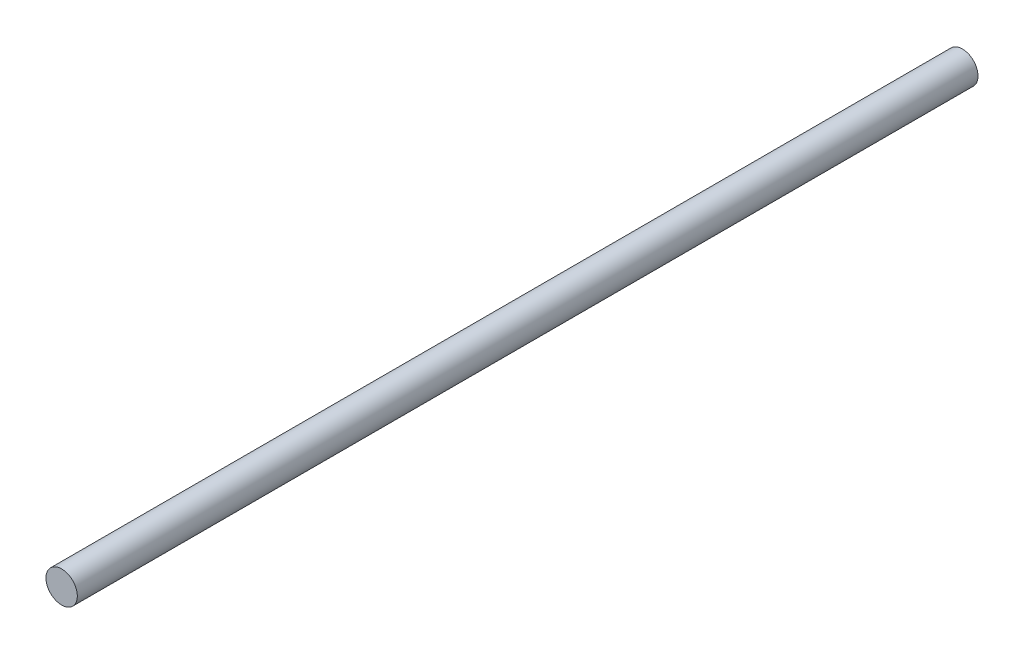
ISO-10303-21;
HEADER;
FILE_DESCRIPTION(('STEP AP214'),'2;1');
FILE_NAME('part.step','',(''),(''),'','','');
FILE_SCHEMA(('AUTOMOTIVE_DESIGN { 1 0 10303 214 1 1 1 1 }'));
ENDSEC;
DATA;
#1=APPLICATION_CONTEXT('core data for automotive mechanical design processes');
#2=APPLICATION_PROTOCOL_DEFINITION('international standard','automotive_design',2000,#1);
#3=PRODUCT_CONTEXT('',#1,'mechanical');
#4=PRODUCT('Part','Part','',(#3));
#5=PRODUCT_RELATED_PRODUCT_CATEGORY('part','',(#4));
#6=PRODUCT_DEFINITION_FORMATION('','',#4);
#7=PRODUCT_DEFINITION_CONTEXT('part definition',#1,'design');
#8=PRODUCT_DEFINITION('design','',#6,#7);
#9=PRODUCT_DEFINITION_SHAPE('','',#8);
#10=(LENGTH_UNIT() NAMED_UNIT(*) SI_UNIT(.MILLI.,.METRE.));
#11=(NAMED_UNIT(*) PLANE_ANGLE_UNIT() SI_UNIT($,.RADIAN.));
#12=(NAMED_UNIT(*) SI_UNIT($,.STERADIAN.) SOLID_ANGLE_UNIT());
#13=UNCERTAINTY_MEASURE_WITH_UNIT(LENGTH_MEASURE(1.E-05),#10,'distance_accuracy_value','');
#14=(GEOMETRIC_REPRESENTATION_CONTEXT(3) GLOBAL_UNCERTAINTY_ASSIGNED_CONTEXT((#13)) GLOBAL_UNIT_ASSIGNED_CONTEXT((#10,
#11,#12)) REPRESENTATION_CONTEXT('',''));
#15=CARTESIAN_POINT('',(0.,0.,0.));
#16=DIRECTION('',(0.,0.,1.));
#17=DIRECTION('',(1.,0.,0.));
#18=AXIS2_PLACEMENT_3D('',#15,#16,#17);
#19=CARTESIAN_POINT('',(0.,0.,189.270562748477));
#20=DIRECTION('',(0.,0.,-1.));
#21=DIRECTION('',(-1.,0.,0.));
#22=AXIS2_PLACEMENT_3D('',#19,#20,#21);
#23=CYLINDRICAL_SURFACE('',#22,6.);
#24=CARTESIAN_POINT('',(0.,0.,172.3));
#25=DIRECTION('',(0.,0.,1.));
#26=DIRECTION('',(1.,0.,0.));
#27=AXIS2_PLACEMENT_3D('',#24,#25,#26);
#28=CIRCLE('',#27,6.);
#29=CARTESIAN_POINT('',(6.,0.,172.3));
#30=VERTEX_POINT('',#29);
#31=EDGE_CURVE('E10',#30,#30,#28,.T.);
#32=ORIENTED_EDGE('',*,*,#31,.F.);
#33=EDGE_LOOP('',(#32));
#34=FACE_BOUND('',#33,.T.);
#35=CARTESIAN_POINT('',(0.,0.,-172.3));
#36=DIRECTION('',(0.,0.,1.));
#37=DIRECTION('',(1.,0.,0.));
#38=AXIS2_PLACEMENT_3D('',#35,#36,#37);
#39=CIRCLE('',#38,6.);
#40=CARTESIAN_POINT('',(6.,0.,-172.3));
#41=VERTEX_POINT('',#40);
#42=EDGE_CURVE('E40',#41,#41,#39,.T.);
#43=ORIENTED_EDGE('',*,*,#42,.T.);
#44=EDGE_LOOP('',(#43));
#45=FACE_BOUND('',#44,.T.);
#46=ADVANCED_FACE('F33',(#34,#45),#23,.T.);
#47=CARTESIAN_POINT('',(0.,-104.,172.3));
#48=DIRECTION('',(0.,0.,1.));
#49=DIRECTION('',(1.,0.,0.));
#50=AXIS2_PLACEMENT_3D('',#47,#48,#49);
#51=PLANE('',#50);
#52=ORIENTED_EDGE('',*,*,#31,.T.);
#53=EDGE_LOOP('',(#52));
#54=FACE_BOUND('',#53,.T.);
#55=ADVANCED_FACE('F35',(#54),#51,.T.);
#56=CARTESIAN_POINT('',(0.,-104.,-172.3));
#57=DIRECTION('',(0.,0.,-1.));
#58=DIRECTION('',(1.,0.,0.));
#59=AXIS2_PLACEMENT_3D('',#56,#57,#58);
#60=PLANE('',#59);
#61=ORIENTED_EDGE('',*,*,#42,.F.);
#62=EDGE_LOOP('',(#61));
#63=FACE_BOUND('',#62,.T.);
#64=ADVANCED_FACE('F47',(#63),#60,.T.);
#65=CLOSED_SHELL('',(#46,#55,#64));
#66=MANIFOLD_SOLID_BREP('B2',#65);
#67=ADVANCED_BREP_SHAPE_REPRESENTATION('',(#18,#66),#14);
#68=SHAPE_DEFINITION_REPRESENTATION(#9,#67);
ENDSEC;
END-ISO-10303-21;
